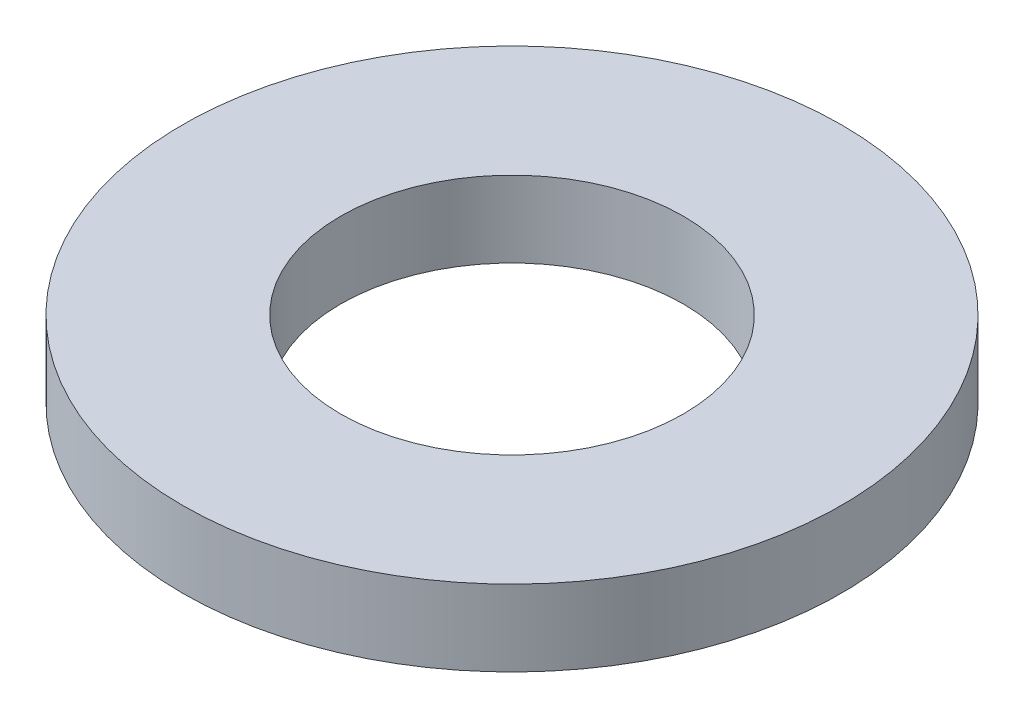
ISO-10303-21;
HEADER;
FILE_DESCRIPTION(('STEP AP214'),'2;1');
FILE_NAME('part.step','',(''),(''),'','','');
FILE_SCHEMA(('AUTOMOTIVE_DESIGN { 1 0 10303 214 1 1 1 1 }'));
ENDSEC;
DATA;
#1=APPLICATION_CONTEXT('core data for automotive mechanical design processes');
#2=APPLICATION_PROTOCOL_DEFINITION('international standard','automotive_design',2000,#1);
#3=PRODUCT_CONTEXT('',#1,'mechanical');
#4=PRODUCT('Part','Part','',(#3));
#5=PRODUCT_RELATED_PRODUCT_CATEGORY('part','',(#4));
#6=PRODUCT_DEFINITION_FORMATION('','',#4);
#7=PRODUCT_DEFINITION_CONTEXT('part definition',#1,'design');
#8=PRODUCT_DEFINITION('design','',#6,#7);
#9=PRODUCT_DEFINITION_SHAPE('','',#8);
#10=(LENGTH_UNIT() NAMED_UNIT(*) SI_UNIT(.MILLI.,.METRE.));
#11=(NAMED_UNIT(*) PLANE_ANGLE_UNIT() SI_UNIT($,.RADIAN.));
#12=(NAMED_UNIT(*) SI_UNIT($,.STERADIAN.) SOLID_ANGLE_UNIT());
#13=UNCERTAINTY_MEASURE_WITH_UNIT(LENGTH_MEASURE(1.E-05),#10,'distance_accuracy_value','');
#14=(GEOMETRIC_REPRESENTATION_CONTEXT(3) GLOBAL_UNCERTAINTY_ASSIGNED_CONTEXT((#13)) GLOBAL_UNIT_ASSIGNED_CONTEXT((#10,
#11,#12)) REPRESENTATION_CONTEXT('',''));
#15=CARTESIAN_POINT('',(0.,0.,0.));
#16=DIRECTION('',(0.,0.,1.));
#17=DIRECTION('',(1.,0.,0.));
#18=AXIS2_PLACEMENT_3D('',#15,#16,#17);
#19=CARTESIAN_POINT('',(0.,6.35,0.));
#20=DIRECTION('',(0.,1.,0.));
#21=DIRECTION('',(0.,0.,1.));
#22=AXIS2_PLACEMENT_3D('',#19,#20,#21);
#23=PLANE('',#22);
#24=CARTESIAN_POINT('',(0.,6.35,0.));
#25=DIRECTION('',(0.,1.,0.));
#26=DIRECTION('',(0.,0.,1.));
#27=AXIS2_PLACEMENT_3D('',#24,#25,#26);
#28=CIRCLE('',#27,27.5);
#29=CARTESIAN_POINT('',(0.,6.35,27.5));
#30=VERTEX_POINT('',#29);
#31=EDGE_CURVE('E10',#30,#30,#28,.T.);
#32=ORIENTED_EDGE('',*,*,#31,.T.);
#33=EDGE_LOOP('',(#32));
#34=FACE_BOUND('',#33,.T.);
#35=CARTESIAN_POINT('',(0.,6.35,0.));
#36=DIRECTION('',(0.,1.,0.));
#37=DIRECTION('',(0.,0.,1.));
#38=AXIS2_PLACEMENT_3D('',#35,#36,#37);
#39=CIRCLE('',#38,14.3);
#40=CARTESIAN_POINT('',(0.,6.35,14.3));
#41=VERTEX_POINT('',#40);
#42=EDGE_CURVE('E54',#41,#41,#39,.T.);
#43=ORIENTED_EDGE('',*,*,#42,.F.);
#44=EDGE_LOOP('',(#43));
#45=FACE_BOUND('',#44,.T.);
#46=ADVANCED_FACE('F41',(#34,#45),#23,.T.);
#47=CARTESIAN_POINT('',(0.,0.,0.));
#48=DIRECTION('',(0.,1.,0.));
#49=DIRECTION('',(0.,0.,1.));
#50=AXIS2_PLACEMENT_3D('',#47,#48,#49);
#51=PLANE('',#50);
#52=CARTESIAN_POINT('',(0.,0.,0.));
#53=DIRECTION('',(0.,1.,0.));
#54=DIRECTION('',(0.,0.,1.));
#55=AXIS2_PLACEMENT_3D('',#52,#53,#54);
#56=CIRCLE('',#55,27.5);
#57=CARTESIAN_POINT('',(0.,0.,27.5));
#58=VERTEX_POINT('',#57);
#59=EDGE_CURVE('E45',#58,#58,#56,.T.);
#60=ORIENTED_EDGE('',*,*,#59,.F.);
#61=EDGE_LOOP('',(#60));
#62=FACE_BOUND('',#61,.T.);
#63=CARTESIAN_POINT('',(0.,0.,0.));
#64=DIRECTION('',(0.,1.,0.));
#65=DIRECTION('',(0.,0.,1.));
#66=AXIS2_PLACEMENT_3D('',#63,#64,#65);
#67=CIRCLE('',#66,14.3);
#68=CARTESIAN_POINT('',(0.,0.,14.3));
#69=VERTEX_POINT('',#68);
#70=EDGE_CURVE('E56',#69,#69,#67,.T.);
#71=ORIENTED_EDGE('',*,*,#70,.T.);
#72=EDGE_LOOP('',(#71));
#73=FACE_BOUND('',#72,.T.);
#74=ADVANCED_FACE('F68',(#62,#73),#51,.F.);
#75=CARTESIAN_POINT('',(0.,6.35,0.));
#76=DIRECTION('',(0.,-1.,0.));
#77=DIRECTION('',(0.,0.,-1.));
#78=AXIS2_PLACEMENT_3D('',#75,#76,#77);
#79=CYLINDRICAL_SURFACE('',#78,27.5);
#80=ORIENTED_EDGE('',*,*,#31,.F.);
#81=EDGE_LOOP('',(#80));
#82=FACE_BOUND('',#81,.T.);
#83=ORIENTED_EDGE('',*,*,#59,.T.);
#84=EDGE_LOOP('',(#83));
#85=FACE_BOUND('',#84,.T.);
#86=ADVANCED_FACE('F43',(#82,#85),#79,.T.);
#87=CARTESIAN_POINT('',(0.,6.35,0.));
#88=DIRECTION('',(0.,-1.,0.));
#89=DIRECTION('',(0.,0.,-1.));
#90=AXIS2_PLACEMENT_3D('',#87,#88,#89);
#91=CYLINDRICAL_SURFACE('',#90,14.3);
#92=ORIENTED_EDGE('',*,*,#42,.T.);
#93=EDGE_LOOP('',(#92));
#94=FACE_BOUND('',#93,.T.);
#95=ORIENTED_EDGE('',*,*,#70,.F.);
#96=EDGE_LOOP('',(#95));
#97=FACE_BOUND('',#96,.T.);
#98=ADVANCED_FACE('F64',(#94,#97),#91,.F.);
#99=CLOSED_SHELL('',(#46,#74,#86,#98));
#100=MANIFOLD_SOLID_BREP('B2',#99);
#101=ADVANCED_BREP_SHAPE_REPRESENTATION('',(#18,#100),#14);
#102=SHAPE_DEFINITION_REPRESENTATION(#9,#101);
ENDSEC;
END-ISO-10303-21;
